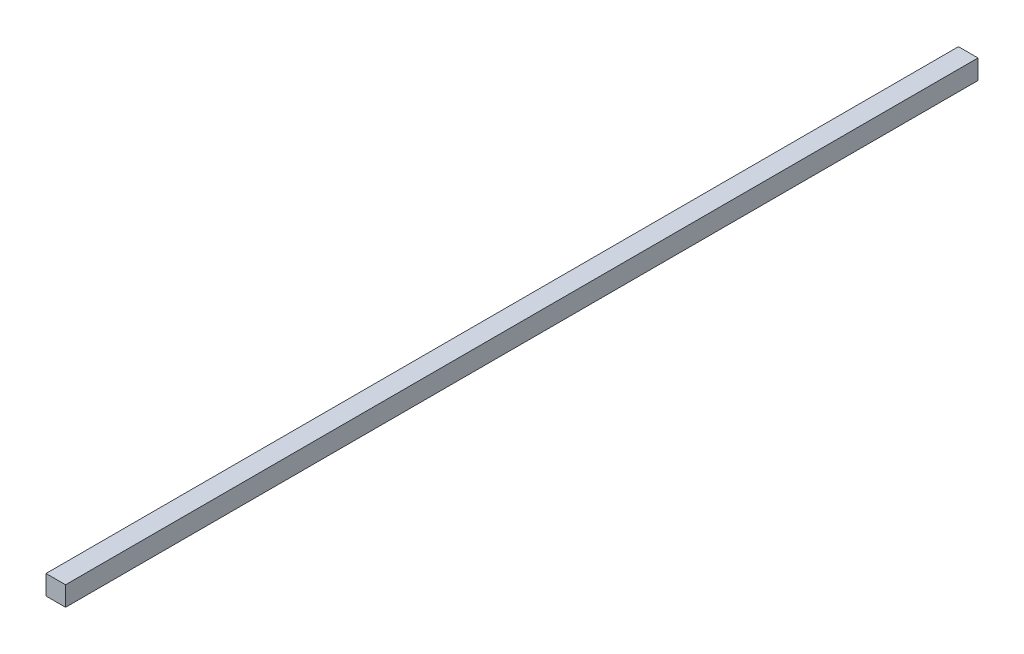
ISO-10303-21;
HEADER;
FILE_DESCRIPTION(('STEP AP214'),'2;1');
FILE_NAME('part.step','',(''),(''),'','','');
FILE_SCHEMA(('AUTOMOTIVE_DESIGN { 1 0 10303 214 1 1 1 1 }'));
ENDSEC;
DATA;
#1=APPLICATION_CONTEXT('core data for automotive mechanical design processes');
#2=APPLICATION_PROTOCOL_DEFINITION('international standard','automotive_design',2000,#1);
#3=PRODUCT_CONTEXT('',#1,'mechanical');
#4=PRODUCT('Part','Part','',(#3));
#5=PRODUCT_RELATED_PRODUCT_CATEGORY('part','',(#4));
#6=PRODUCT_DEFINITION_FORMATION('','',#4);
#7=PRODUCT_DEFINITION_CONTEXT('part definition',#1,'design');
#8=PRODUCT_DEFINITION('design','',#6,#7);
#9=PRODUCT_DEFINITION_SHAPE('','',#8);
#10=(LENGTH_UNIT() NAMED_UNIT(*) SI_UNIT(.MILLI.,.METRE.));
#11=(NAMED_UNIT(*) PLANE_ANGLE_UNIT() SI_UNIT($,.RADIAN.));
#12=(NAMED_UNIT(*) SI_UNIT($,.STERADIAN.) SOLID_ANGLE_UNIT());
#13=UNCERTAINTY_MEASURE_WITH_UNIT(LENGTH_MEASURE(1.E-05),#10,'distance_accuracy_value','');
#14=(GEOMETRIC_REPRESENTATION_CONTEXT(3) GLOBAL_UNCERTAINTY_ASSIGNED_CONTEXT((#13)) GLOBAL_UNIT_ASSIGNED_CONTEXT((#10,
#11,#12)) REPRESENTATION_CONTEXT('',''));
#15=CARTESIAN_POINT('',(0.,0.,0.));
#16=DIRECTION('',(0.,0.,1.));
#17=DIRECTION('',(1.,0.,0.));
#18=AXIS2_PLACEMENT_3D('',#15,#16,#17);
#19=CARTESIAN_POINT('',(15.,15.,1400.));
#20=DIRECTION('',(-1.,0.,0.));
#21=DIRECTION('',(0.,-1.,0.));
#22=AXIS2_PLACEMENT_3D('',#19,#20,#21);
#23=PLANE('',#22);
#24=DIRECTION('',(0.,1.,0.));
#25=VECTOR('',#24,1.);
#26=CARTESIAN_POINT('',(15.,15.,0.));
#27=LINE('',#26,#25);
#28=CARTESIAN_POINT('',(15.,-15.,0.));
#29=VERTEX_POINT('',#28);
#30=CARTESIAN_POINT('',(15.,15.,0.));
#31=VERTEX_POINT('',#30);
#32=EDGE_CURVE('E98',#29,#31,#27,.T.);
#33=ORIENTED_EDGE('',*,*,#32,.T.);
#34=DIRECTION('',(0.,0.,-1.));
#35=VECTOR('',#34,1.);
#36=CARTESIAN_POINT('',(15.,15.,1400.));
#37=LINE('',#36,#35);
#38=CARTESIAN_POINT('',(15.,15.,1400.));
#39=VERTEX_POINT('',#38);
#40=EDGE_CURVE('E11',#39,#31,#37,.T.);
#41=ORIENTED_EDGE('',*,*,#40,.F.);
#42=DIRECTION('',(0.,1.,0.));
#43=VECTOR('',#42,1.);
#44=CARTESIAN_POINT('',(15.,15.,1400.));
#45=LINE('',#44,#43);
#46=CARTESIAN_POINT('',(15.,-15.,1400.));
#47=VERTEX_POINT('',#46);
#48=EDGE_CURVE('E86',#47,#39,#45,.T.);
#49=ORIENTED_EDGE('',*,*,#48,.F.);
#50=DIRECTION('',(0.,0.,-1.));
#51=VECTOR('',#50,1.);
#52=CARTESIAN_POINT('',(15.,-15.,1400.));
#53=LINE('',#52,#51);
#54=EDGE_CURVE('E94',#47,#29,#53,.T.);
#55=ORIENTED_EDGE('',*,*,#54,.T.);
#56=EDGE_LOOP('',(#33,#41,#49,#55));
#57=FACE_BOUND('',#56,.T.);
#58=ADVANCED_FACE('F35',(#57),#23,.F.);
#59=CARTESIAN_POINT('',(-15.,15.,1400.));
#60=DIRECTION('',(0.,-1.,0.));
#61=DIRECTION('',(0.,0.,-1.));
#62=AXIS2_PLACEMENT_3D('',#59,#60,#61);
#63=PLANE('',#62);
#64=DIRECTION('',(-1.,0.,0.));
#65=VECTOR('',#64,1.);
#66=CARTESIAN_POINT('',(-15.,15.,0.));
#67=LINE('',#66,#65);
#68=CARTESIAN_POINT('',(-15.,15.,0.));
#69=VERTEX_POINT('',#68);
#70=EDGE_CURVE('E90',#31,#69,#67,.T.);
#71=ORIENTED_EDGE('',*,*,#70,.T.);
#72=DIRECTION('',(0.,0.,-1.));
#73=VECTOR('',#72,1.);
#74=CARTESIAN_POINT('',(-15.,15.,1400.));
#75=LINE('',#74,#73);
#76=CARTESIAN_POINT('',(-15.,15.,1400.));
#77=VERTEX_POINT('',#76);
#78=EDGE_CURVE('E43',#77,#69,#75,.T.);
#79=ORIENTED_EDGE('',*,*,#78,.F.);
#80=DIRECTION('',(-1.,0.,0.));
#81=VECTOR('',#80,1.);
#82=CARTESIAN_POINT('',(-15.,15.,1400.));
#83=LINE('',#82,#81);
#84=EDGE_CURVE('E81',#39,#77,#83,.T.);
#85=ORIENTED_EDGE('',*,*,#84,.F.);
#86=ORIENTED_EDGE('',*,*,#40,.T.);
#87=EDGE_LOOP('',(#71,#79,#85,#86));
#88=FACE_BOUND('',#87,.T.);
#89=ADVANCED_FACE('F89',(#88),#63,.F.);
#90=CARTESIAN_POINT('',(-15.,15.,1400.));
#91=DIRECTION('',(1.,0.,0.));
#92=DIRECTION('',(0.,1.,0.));
#93=AXIS2_PLACEMENT_3D('',#90,#91,#92);
#94=PLANE('',#93);
#95=DIRECTION('',(0.,-1.,0.));
#96=VECTOR('',#95,1.);
#97=CARTESIAN_POINT('',(-15.,15.,0.));
#98=LINE('',#97,#96);
#99=CARTESIAN_POINT('',(-15.,-15.,0.));
#100=VERTEX_POINT('',#99);
#101=EDGE_CURVE('E68',#69,#100,#98,.T.);
#102=ORIENTED_EDGE('',*,*,#101,.T.);
#103=DIRECTION('',(0.,0.,-1.));
#104=VECTOR('',#103,1.);
#105=CARTESIAN_POINT('',(-15.,-15.,1400.));
#106=LINE('',#105,#104);
#107=CARTESIAN_POINT('',(-15.,-15.,1400.));
#108=VERTEX_POINT('',#107);
#109=EDGE_CURVE('E91',#108,#100,#106,.T.);
#110=ORIENTED_EDGE('',*,*,#109,.F.);
#111=DIRECTION('',(0.,-1.,0.));
#112=VECTOR('',#111,1.);
#113=CARTESIAN_POINT('',(-15.,15.,1400.));
#114=LINE('',#113,#112);
#115=EDGE_CURVE('E84',#77,#108,#114,.T.);
#116=ORIENTED_EDGE('',*,*,#115,.F.);
#117=ORIENTED_EDGE('',*,*,#78,.T.);
#118=EDGE_LOOP('',(#102,#110,#116,#117));
#119=FACE_BOUND('',#118,.T.);
#120=ADVANCED_FACE('F92',(#119),#94,.F.);
#121=CARTESIAN_POINT('',(-15.,-15.,1400.));
#122=DIRECTION('',(0.,1.,0.));
#123=DIRECTION('',(0.,0.,1.));
#124=AXIS2_PLACEMENT_3D('',#121,#122,#123);
#125=PLANE('',#124);
#126=DIRECTION('',(1.,0.,0.));
#127=VECTOR('',#126,1.);
#128=CARTESIAN_POINT('',(-15.,-15.,0.));
#129=LINE('',#128,#127);
#130=EDGE_CURVE('E74',#100,#29,#129,.T.);
#131=ORIENTED_EDGE('',*,*,#130,.T.);
#132=ORIENTED_EDGE('',*,*,#54,.F.);
#133=DIRECTION('',(1.,0.,0.));
#134=VECTOR('',#133,1.);
#135=CARTESIAN_POINT('',(-15.,-15.,1400.));
#136=LINE('',#135,#134);
#137=EDGE_CURVE('E51',#108,#47,#136,.T.);
#138=ORIENTED_EDGE('',*,*,#137,.F.);
#139=ORIENTED_EDGE('',*,*,#109,.T.);
#140=EDGE_LOOP('',(#131,#132,#138,#139));
#141=FACE_BOUND('',#140,.T.);
#142=ADVANCED_FACE('F105',(#141),#125,.F.);
#143=CARTESIAN_POINT('',(0.,0.,1400.));
#144=DIRECTION('',(0.,0.,1.));
#145=DIRECTION('',(1.,0.,0.));
#146=AXIS2_PLACEMENT_3D('',#143,#144,#145);
#147=PLANE('',#146);
#148=ORIENTED_EDGE('',*,*,#48,.T.);
#149=ORIENTED_EDGE('',*,*,#84,.T.);
#150=ORIENTED_EDGE('',*,*,#115,.T.);
#151=ORIENTED_EDGE('',*,*,#137,.T.);
#152=EDGE_LOOP('',(#148,#149,#150,#151));
#153=FACE_BOUND('',#152,.T.);
#154=ADVANCED_FACE('F82',(#153),#147,.T.);
#155=CARTESIAN_POINT('',(0.,0.,0.));
#156=DIRECTION('',(0.,0.,1.));
#157=DIRECTION('',(1.,0.,0.));
#158=AXIS2_PLACEMENT_3D('',#155,#156,#157);
#159=PLANE('',#158);
#160=ORIENTED_EDGE('',*,*,#32,.F.);
#161=ORIENTED_EDGE('',*,*,#130,.F.);
#162=ORIENTED_EDGE('',*,*,#101,.F.);
#163=ORIENTED_EDGE('',*,*,#70,.F.);
#164=EDGE_LOOP('',(#160,#161,#162,#163));
#165=FACE_BOUND('',#164,.T.);
#166=ADVANCED_FACE('F108',(#165),#159,.F.);
#167=CLOSED_SHELL('',(#58,#89,#120,#142,#154,#166));
#168=MANIFOLD_SOLID_BREP('B2',#167);
#169=ADVANCED_BREP_SHAPE_REPRESENTATION('',(#18,#168),#14);
#170=SHAPE_DEFINITION_REPRESENTATION(#9,#169);
ENDSEC;
END-ISO-10303-21;
